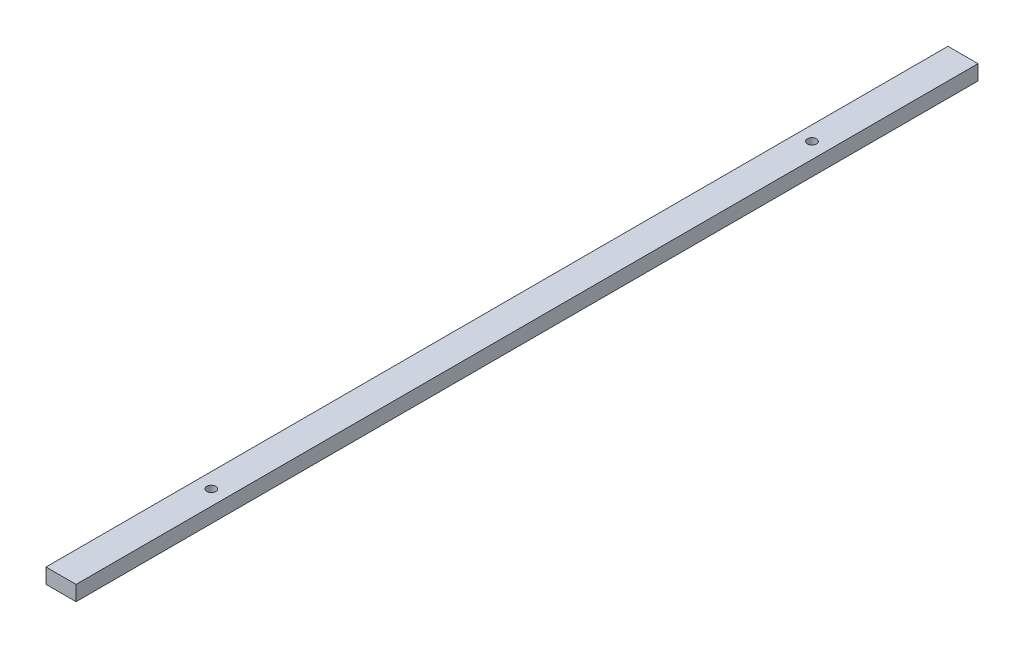
ISO-10303-21;
HEADER;
FILE_DESCRIPTION(('STEP AP214'),'2;1');
FILE_NAME('part.step','',(''),(''),'','','');
FILE_SCHEMA(('AUTOMOTIVE_DESIGN { 1 0 10303 214 1 1 1 1 }'));
ENDSEC;
DATA;
#1=APPLICATION_CONTEXT('core data for automotive mechanical design processes');
#2=APPLICATION_PROTOCOL_DEFINITION('international standard','automotive_design',2000,#1);
#3=PRODUCT_CONTEXT('',#1,'mechanical');
#4=PRODUCT('Part','Part','',(#3));
#5=PRODUCT_RELATED_PRODUCT_CATEGORY('part','',(#4));
#6=PRODUCT_DEFINITION_FORMATION('','',#4);
#7=PRODUCT_DEFINITION_CONTEXT('part definition',#1,'design');
#8=PRODUCT_DEFINITION('design','',#6,#7);
#9=PRODUCT_DEFINITION_SHAPE('','',#8);
#10=(LENGTH_UNIT() NAMED_UNIT(*) SI_UNIT(.MILLI.,.METRE.));
#11=(NAMED_UNIT(*) PLANE_ANGLE_UNIT() SI_UNIT($,.RADIAN.));
#12=(NAMED_UNIT(*) SI_UNIT($,.STERADIAN.) SOLID_ANGLE_UNIT());
#13=UNCERTAINTY_MEASURE_WITH_UNIT(LENGTH_MEASURE(1.E-05),#10,'distance_accuracy_value','');
#14=(GEOMETRIC_REPRESENTATION_CONTEXT(3) GLOBAL_UNCERTAINTY_ASSIGNED_CONTEXT((#13)) GLOBAL_UNIT_ASSIGNED_CONTEXT((#10,
#11,#12)) REPRESENTATION_CONTEXT('',''));
#15=CARTESIAN_POINT('',(0.,0.,0.));
#16=DIRECTION('',(0.,0.,1.));
#17=DIRECTION('',(1.,0.,0.));
#18=AXIS2_PLACEMENT_3D('',#15,#16,#17);
#19=CARTESIAN_POINT('',(-4.76793248945147,0.379746835443036,300.));
#20=DIRECTION('',(1.,0.,0.));
#21=DIRECTION('',(0.,1.,0.));
#22=AXIS2_PLACEMENT_3D('',#19,#20,#21);
#23=PLANE('',#22);
#24=DIRECTION('',(0.,-1.,0.));
#25=VECTOR('',#24,1.);
#26=CARTESIAN_POINT('',(-4.76793248945147,0.379746835443036,0.));
#27=LINE('',#26,#25);
#28=CARTESIAN_POINT('',(-4.76793248945147,0.379746835443036,0.));
#29=VERTEX_POINT('',#28);
#30=CARTESIAN_POINT('',(-4.76793248945147,-4.62025316455696,0.));
#31=VERTEX_POINT('',#30);
#32=EDGE_CURVE('E99',#29,#31,#27,.T.);
#33=ORIENTED_EDGE('',*,*,#32,.T.);
#34=DIRECTION('',(0.,0.,-1.));
#35=VECTOR('',#34,1.);
#36=CARTESIAN_POINT('',(-4.76793248945147,-4.62025316455696,300.));
#37=LINE('',#36,#35);
#38=CARTESIAN_POINT('',(-4.76793248945147,-4.62025316455696,300.));
#39=VERTEX_POINT('',#38);
#40=EDGE_CURVE('E11',#39,#31,#37,.T.);
#41=ORIENTED_EDGE('',*,*,#40,.F.);
#42=DIRECTION('',(0.,-1.,0.));
#43=VECTOR('',#42,1.);
#44=CARTESIAN_POINT('',(-4.76793248945147,0.379746835443036,300.));
#45=LINE('',#44,#43);
#46=CARTESIAN_POINT('',(-4.76793248945147,0.379746835443036,300.));
#47=VERTEX_POINT('',#46);
#48=EDGE_CURVE('E86',#47,#39,#45,.T.);
#49=ORIENTED_EDGE('',*,*,#48,.F.);
#50=DIRECTION('',(0.,0.,-1.));
#51=VECTOR('',#50,1.);
#52=CARTESIAN_POINT('',(-4.76793248945147,0.379746835443036,300.));
#53=LINE('',#52,#51);
#54=EDGE_CURVE('E95',#47,#29,#53,.T.);
#55=ORIENTED_EDGE('',*,*,#54,.T.);
#56=EDGE_LOOP('',(#33,#41,#49,#55));
#57=FACE_BOUND('',#56,.T.);
#58=ADVANCED_FACE('F33',(#57),#23,.F.);
#59=CARTESIAN_POINT('',(-4.76793248945147,-4.62025316455696,300.));
#60=DIRECTION('',(0.,1.,0.));
#61=DIRECTION('',(0.,0.,1.));
#62=AXIS2_PLACEMENT_3D('',#59,#60,#61);
#63=PLANE('',#62);
#64=CARTESIAN_POINT('',(0.232067510548528,-4.62025316455696,250.));
#65=DIRECTION('',(0.,1.,0.));
#66=DIRECTION('',(0.,0.,1.));
#67=AXIS2_PLACEMENT_3D('',#64,#65,#66);
#68=CIRCLE('',#67,1.5);
#69=CARTESIAN_POINT('',(0.232067510548528,-4.62025316455696,251.5));
#70=VERTEX_POINT('',#69);
#71=EDGE_CURVE('E108',#70,#70,#68,.T.);
#72=ORIENTED_EDGE('',*,*,#71,.T.);
#73=EDGE_LOOP('',(#72));
#74=FACE_BOUND('',#73,.T.);
#75=CARTESIAN_POINT('',(0.,-4.62025316455696,50.));
#76=DIRECTION('',(0.,1.,0.));
#77=DIRECTION('',(0.,0.,1.));
#78=AXIS2_PLACEMENT_3D('',#75,#76,#77);
#79=CIRCLE('',#78,1.5);
#80=CARTESIAN_POINT('',(0.,-4.62025316455696,51.5));
#81=VERTEX_POINT('',#80);
#82=EDGE_CURVE('E113',#81,#81,#79,.T.);
#83=ORIENTED_EDGE('',*,*,#82,.T.);
#84=EDGE_LOOP('',(#83));
#85=FACE_BOUND('',#84,.T.);
#86=DIRECTION('',(1.,0.,0.));
#87=VECTOR('',#86,1.);
#88=CARTESIAN_POINT('',(-4.76793248945147,-4.62025316455696,0.));
#89=LINE('',#88,#87);
#90=CARTESIAN_POINT('',(5.23206751054853,-4.62025316455696,0.));
#91=VERTEX_POINT('',#90);
#92=EDGE_CURVE('E90',#31,#91,#89,.T.);
#93=ORIENTED_EDGE('',*,*,#92,.T.);
#94=DIRECTION('',(0.,0.,-1.));
#95=VECTOR('',#94,1.);
#96=CARTESIAN_POINT('',(5.23206751054853,-4.62025316455696,300.));
#97=LINE('',#96,#95);
#98=CARTESIAN_POINT('',(5.23206751054853,-4.62025316455696,300.));
#99=VERTEX_POINT('',#98);
#100=EDGE_CURVE('E42',#99,#91,#97,.T.);
#101=ORIENTED_EDGE('',*,*,#100,.F.);
#102=DIRECTION('',(1.,0.,0.));
#103=VECTOR('',#102,1.);
#104=CARTESIAN_POINT('',(-4.76793248945147,-4.62025316455696,300.));
#105=LINE('',#104,#103);
#106=EDGE_CURVE('E81',#39,#99,#105,.T.);
#107=ORIENTED_EDGE('',*,*,#106,.F.);
#108=ORIENTED_EDGE('',*,*,#40,.T.);
#109=EDGE_LOOP('',(#93,#101,#107,#108));
#110=FACE_BOUND('',#109,.T.);
#111=ADVANCED_FACE('F89',(#74,#85,#110),#63,.F.);
#112=CARTESIAN_POINT('',(5.23206751054853,0.379746835443036,300.));
#113=DIRECTION('',(-1.,0.,0.));
#114=DIRECTION('',(0.,-1.,0.));
#115=AXIS2_PLACEMENT_3D('',#112,#113,#114);
#116=PLANE('',#115);
#117=DIRECTION('',(0.,1.,0.));
#118=VECTOR('',#117,1.);
#119=CARTESIAN_POINT('',(5.23206751054853,0.379746835443036,0.));
#120=LINE('',#119,#118);
#121=CARTESIAN_POINT('',(5.23206751054853,0.379746835443036,0.));
#122=VERTEX_POINT('',#121);
#123=EDGE_CURVE('E68',#91,#122,#120,.T.);
#124=ORIENTED_EDGE('',*,*,#123,.T.);
#125=DIRECTION('',(0.,0.,-1.));
#126=VECTOR('',#125,1.);
#127=CARTESIAN_POINT('',(5.23206751054853,0.379746835443036,300.));
#128=LINE('',#127,#126);
#129=CARTESIAN_POINT('',(5.23206751054853,0.379746835443036,300.));
#130=VERTEX_POINT('',#129);
#131=EDGE_CURVE('E91',#130,#122,#128,.T.);
#132=ORIENTED_EDGE('',*,*,#131,.F.);
#133=DIRECTION('',(0.,1.,0.));
#134=VECTOR('',#133,1.);
#135=CARTESIAN_POINT('',(5.23206751054853,0.379746835443036,300.));
#136=LINE('',#135,#134);
#137=EDGE_CURVE('E84',#99,#130,#136,.T.);
#138=ORIENTED_EDGE('',*,*,#137,.F.);
#139=ORIENTED_EDGE('',*,*,#100,.T.);
#140=EDGE_LOOP('',(#124,#132,#138,#139));
#141=FACE_BOUND('',#140,.T.);
#142=ADVANCED_FACE('F93',(#141),#116,.F.);
#143=CARTESIAN_POINT('',(-4.76793248945147,0.379746835443036,300.));
#144=DIRECTION('',(0.,-1.,0.));
#145=DIRECTION('',(0.,0.,-1.));
#146=AXIS2_PLACEMENT_3D('',#143,#144,#145);
#147=PLANE('',#146);
#148=CARTESIAN_POINT('',(0.232067510548528,0.379746835443036,250.));
#149=DIRECTION('',(0.,-1.,0.));
#150=DIRECTION('',(0.,0.,-1.));
#151=AXIS2_PLACEMENT_3D('',#148,#149,#150);
#152=CIRCLE('',#151,1.5);
#153=CARTESIAN_POINT('',(0.232067510548528,0.379746835443036,248.5));
#154=VERTEX_POINT('',#153);
#155=EDGE_CURVE('E36',#154,#154,#152,.T.);
#156=ORIENTED_EDGE('',*,*,#155,.T.);
#157=EDGE_LOOP('',(#156));
#158=FACE_BOUND('',#157,.T.);
#159=CARTESIAN_POINT('',(0.,0.379746835443036,50.));
#160=DIRECTION('',(0.,-1.,0.));
#161=DIRECTION('',(0.,0.,-1.));
#162=AXIS2_PLACEMENT_3D('',#159,#160,#161);
#163=CIRCLE('',#162,1.5);
#164=CARTESIAN_POINT('',(0.,0.379746835443036,48.5));
#165=VERTEX_POINT('',#164);
#166=EDGE_CURVE('E106',#165,#165,#163,.T.);
#167=ORIENTED_EDGE('',*,*,#166,.T.);
#168=EDGE_LOOP('',(#167));
#169=FACE_BOUND('',#168,.T.);
#170=DIRECTION('',(-1.,0.,0.));
#171=VECTOR('',#170,1.);
#172=CARTESIAN_POINT('',(-4.76793248945147,0.379746835443036,0.));
#173=LINE('',#172,#171);
#174=EDGE_CURVE('E74',#122,#29,#173,.T.);
#175=ORIENTED_EDGE('',*,*,#174,.T.);
#176=ORIENTED_EDGE('',*,*,#54,.F.);
#177=DIRECTION('',(-1.,0.,0.));
#178=VECTOR('',#177,1.);
#179=CARTESIAN_POINT('',(-4.76793248945147,0.379746835443036,300.));
#180=LINE('',#179,#178);
#181=EDGE_CURVE('E51',#130,#47,#180,.T.);
#182=ORIENTED_EDGE('',*,*,#181,.F.);
#183=ORIENTED_EDGE('',*,*,#131,.T.);
#184=EDGE_LOOP('',(#175,#176,#182,#183));
#185=FACE_BOUND('',#184,.T.);
#186=ADVANCED_FACE('F143',(#158,#169,#185),#147,.F.);
#187=CARTESIAN_POINT('',(0.,0.,300.));
#188=DIRECTION('',(0.,0.,1.));
#189=DIRECTION('',(1.,0.,0.));
#190=AXIS2_PLACEMENT_3D('',#187,#188,#189);
#191=PLANE('',#190);
#192=ORIENTED_EDGE('',*,*,#48,.T.);
#193=ORIENTED_EDGE('',*,*,#106,.T.);
#194=ORIENTED_EDGE('',*,*,#137,.T.);
#195=ORIENTED_EDGE('',*,*,#181,.T.);
#196=EDGE_LOOP('',(#192,#193,#194,#195));
#197=FACE_BOUND('',#196,.T.);
#198=ADVANCED_FACE('F82',(#197),#191,.T.);
#199=CARTESIAN_POINT('',(0.,0.,0.));
#200=DIRECTION('',(0.,0.,1.));
#201=DIRECTION('',(1.,0.,0.));
#202=AXIS2_PLACEMENT_3D('',#199,#200,#201);
#203=PLANE('',#202);
#204=ORIENTED_EDGE('',*,*,#32,.F.);
#205=ORIENTED_EDGE('',*,*,#174,.F.);
#206=ORIENTED_EDGE('',*,*,#123,.F.);
#207=ORIENTED_EDGE('',*,*,#92,.F.);
#208=EDGE_LOOP('',(#204,#205,#206,#207));
#209=FACE_BOUND('',#208,.T.);
#210=ADVANCED_FACE('F126',(#209),#203,.F.);
#211=CARTESIAN_POINT('',(0.,-4.62025316455696,50.));
#212=DIRECTION('',(0.,1.,0.));
#213=DIRECTION('',(0.,0.,1.));
#214=AXIS2_PLACEMENT_3D('',#211,#212,#213);
#215=CYLINDRICAL_SURFACE('',#214,1.5);
#216=ORIENTED_EDGE('',*,*,#82,.F.);
#217=EDGE_LOOP('',(#216));
#218=FACE_BOUND('',#217,.T.);
#219=ORIENTED_EDGE('',*,*,#166,.F.);
#220=EDGE_LOOP('',(#219));
#221=FACE_BOUND('',#220,.T.);
#222=ADVANCED_FACE('F122',(#218,#221),#215,.F.);
#223=CARTESIAN_POINT('',(0.232067510548528,-4.62025316455696,250.));
#224=DIRECTION('',(0.,1.,0.));
#225=DIRECTION('',(0.,0.,1.));
#226=AXIS2_PLACEMENT_3D('',#223,#224,#225);
#227=CYLINDRICAL_SURFACE('',#226,1.5);
#228=ORIENTED_EDGE('',*,*,#71,.F.);
#229=EDGE_LOOP('',(#228));
#230=FACE_BOUND('',#229,.T.);
#231=ORIENTED_EDGE('',*,*,#155,.F.);
#232=EDGE_LOOP('',(#231));
#233=FACE_BOUND('',#232,.T.);
#234=ADVANCED_FACE('F125',(#230,#233),#227,.F.);
#235=CLOSED_SHELL('',(#58,#111,#142,#186,#198,#210,#222,#234));
#236=MANIFOLD_SOLID_BREP('B2',#235);
#237=ADVANCED_BREP_SHAPE_REPRESENTATION('',(#18,#236),#14);
#238=SHAPE_DEFINITION_REPRESENTATION(#9,#237);
ENDSEC;
END-ISO-10303-21;
